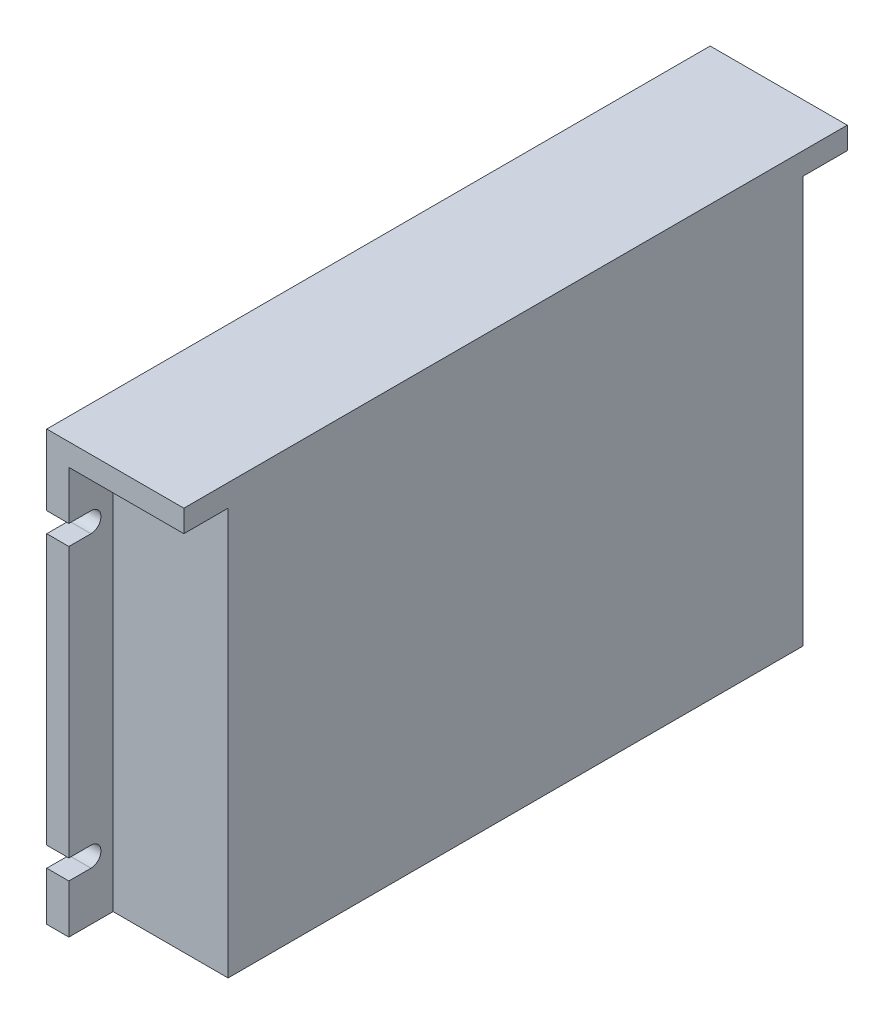
ISO-10303-21;
HEADER;
FILE_DESCRIPTION(('STEP AP214'),'2;1');
FILE_NAME('part.step','',(''),(''),'','','');
FILE_SCHEMA(('AUTOMOTIVE_DESIGN { 1 0 10303 214 1 1 1 1 }'));
ENDSEC;
DATA;
#1=APPLICATION_CONTEXT('core data for automotive mechanical design processes');
#2=APPLICATION_PROTOCOL_DEFINITION('international standard','automotive_design',2000,#1);
#3=PRODUCT_CONTEXT('',#1,'mechanical');
#4=PRODUCT('Part','Part','',(#3));
#5=PRODUCT_RELATED_PRODUCT_CATEGORY('part','',(#4));
#6=PRODUCT_DEFINITION_FORMATION('','',#4);
#7=PRODUCT_DEFINITION_CONTEXT('part definition',#1,'design');
#8=PRODUCT_DEFINITION('design','',#6,#7);
#9=PRODUCT_DEFINITION_SHAPE('','',#8);
#10=(LENGTH_UNIT() NAMED_UNIT(*) SI_UNIT(.MILLI.,.METRE.));
#11=(NAMED_UNIT(*) PLANE_ANGLE_UNIT() SI_UNIT($,.RADIAN.));
#12=(NAMED_UNIT(*) SI_UNIT($,.STERADIAN.) SOLID_ANGLE_UNIT());
#13=UNCERTAINTY_MEASURE_WITH_UNIT(LENGTH_MEASURE(1.E-05),#10,'distance_accuracy_value','');
#14=(GEOMETRIC_REPRESENTATION_CONTEXT(3) GLOBAL_UNCERTAINTY_ASSIGNED_CONTEXT((#13)) GLOBAL_UNIT_ASSIGNED_CONTEXT((#10,
#11,#12)) REPRESENTATION_CONTEXT('',''));
#15=CARTESIAN_POINT('',(0.,0.,0.));
#16=DIRECTION('',(0.,0.,1.));
#17=DIRECTION('',(1.,0.,0.));
#18=AXIS2_PLACEMENT_3D('',#15,#16,#17);
#19=CARTESIAN_POINT('',(31.,48.5,75.));
#20=DIRECTION('',(0.,0.,-1.));
#21=DIRECTION('',(0.,1.,0.));
#22=AXIS2_PLACEMENT_3D('',#19,#20,#21);
#23=PLANE('',#22);
#24=DIRECTION('',(0.,-1.,0.));
#25=VECTOR('',#24,1.);
#26=CARTESIAN_POINT('',(5.,-48.5,75.));
#27=LINE('',#26,#25);
#28=CARTESIAN_POINT('',(5.,28.,75.));
#29=VERTEX_POINT('',#28);
#30=CARTESIAN_POINT('',(5.,-33.,75.));
#31=VERTEX_POINT('',#30);
#32=EDGE_CURVE('E175',#29,#31,#27,.T.);
#33=ORIENTED_EDGE('',*,*,#32,.F.);
#34=DIRECTION('',(1.,0.,0.));
#35=VECTOR('',#34,1.);
#36=CARTESIAN_POINT('',(-21.,28.,75.));
#37=LINE('',#36,#35);
#38=CARTESIAN_POINT('',(0.,28.,75.));
#39=VERTEX_POINT('',#38);
#40=EDGE_CURVE('E398',#39,#29,#37,.T.);
#41=ORIENTED_EDGE('',*,*,#40,.F.);
#42=DIRECTION('',(0.,-1.,0.));
#43=VECTOR('',#42,1.);
#44=CARTESIAN_POINT('',(0.,48.5,75.));
#45=LINE('',#44,#43);
#46=CARTESIAN_POINT('',(0.,-33.,75.));
#47=VERTEX_POINT('',#46);
#48=EDGE_CURVE('E177',#39,#47,#45,.T.);
#49=ORIENTED_EDGE('',*,*,#48,.T.);
#50=DIRECTION('',(1.,0.,0.));
#51=VECTOR('',#50,1.);
#52=CARTESIAN_POINT('',(-21.,-33.,75.));
#53=LINE('',#52,#51);
#54=EDGE_CURVE('E164',#47,#31,#53,.T.);
#55=ORIENTED_EDGE('',*,*,#54,.T.);
#56=EDGE_LOOP('',(#33,#41,#49,#55));
#57=FACE_BOUND('',#56,.T.);
#58=ADVANCED_FACE('F35',(#57),#23,.F.);
#59=CARTESIAN_POINT('',(5.,-37.5,75.));
#60=VERTEX_POINT('',#59);
#61=CARTESIAN_POINT('',(5.,-48.5,75.));
#62=VERTEX_POINT('',#61);
#63=EDGE_CURVE('E185',#60,#62,#27,.T.);
#64=ORIENTED_EDGE('',*,*,#63,.F.);
#65=DIRECTION('',(1.,0.,0.));
#66=VECTOR('',#65,1.);
#67=CARTESIAN_POINT('',(-21.,-37.5,75.));
#68=LINE('',#67,#66);
#69=CARTESIAN_POINT('',(0.,-37.5,75.));
#70=VERTEX_POINT('',#69);
#71=EDGE_CURVE('E178',#70,#60,#68,.T.);
#72=ORIENTED_EDGE('',*,*,#71,.F.);
#73=CARTESIAN_POINT('',(0.,-48.5,75.));
#74=VERTEX_POINT('',#73);
#75=EDGE_CURVE('E211',#70,#74,#45,.T.);
#76=ORIENTED_EDGE('',*,*,#75,.T.);
#77=DIRECTION('',(-1.,0.,0.));
#78=VECTOR('',#77,1.);
#79=CARTESIAN_POINT('',(31.,-48.5,75.));
#80=LINE('',#79,#78);
#81=EDGE_CURVE('E11',#62,#74,#80,.T.);
#82=ORIENTED_EDGE('',*,*,#81,.F.);
#83=EDGE_LOOP('',(#64,#72,#76,#82));
#84=FACE_BOUND('',#83,.T.);
#85=ADVANCED_FACE('F308',(#84),#23,.F.);
#86=CARTESIAN_POINT('',(0.,48.5,75.));
#87=VERTEX_POINT('',#86);
#88=CARTESIAN_POINT('',(0.,32.5,75.));
#89=VERTEX_POINT('',#88);
#90=EDGE_CURVE('E249',#87,#89,#45,.T.);
#91=ORIENTED_EDGE('',*,*,#90,.T.);
#92=DIRECTION('',(1.,0.,0.));
#93=VECTOR('',#92,1.);
#94=CARTESIAN_POINT('',(-21.,32.5,75.));
#95=LINE('',#94,#93);
#96=CARTESIAN_POINT('',(5.,32.5,75.));
#97=VERTEX_POINT('',#96);
#98=EDGE_CURVE('E401',#89,#97,#95,.T.);
#99=ORIENTED_EDGE('',*,*,#98,.T.);
#100=CARTESIAN_POINT('',(5.,43.5,75.));
#101=VERTEX_POINT('',#100);
#102=EDGE_CURVE('E184',#101,#97,#27,.T.);
#103=ORIENTED_EDGE('',*,*,#102,.F.);
#104=DIRECTION('',(1.,0.,0.));
#105=VECTOR('',#104,1.);
#106=CARTESIAN_POINT('',(5.,43.5,75.));
#107=LINE('',#106,#105);
#108=CARTESIAN_POINT('',(31.,43.5,75.));
#109=VERTEX_POINT('',#108);
#110=EDGE_CURVE('E208',#101,#109,#107,.T.);
#111=ORIENTED_EDGE('',*,*,#110,.T.);
#112=DIRECTION('',(0.,-1.,0.));
#113=VECTOR('',#112,1.);
#114=CARTESIAN_POINT('',(31.,48.5,75.));
#115=LINE('',#114,#113);
#116=CARTESIAN_POINT('',(31.,48.5,75.));
#117=VERTEX_POINT('',#116);
#118=EDGE_CURVE('E237',#117,#109,#115,.T.);
#119=ORIENTED_EDGE('',*,*,#118,.F.);
#120=DIRECTION('',(-1.,0.,0.));
#121=VECTOR('',#120,1.);
#122=CARTESIAN_POINT('',(31.,48.5,75.));
#123=LINE('',#122,#121);
#124=EDGE_CURVE('E248',#117,#87,#123,.T.);
#125=ORIENTED_EDGE('',*,*,#124,.T.);
#126=EDGE_LOOP('',(#91,#99,#103,#111,#119,#125));
#127=FACE_BOUND('',#126,.T.);
#128=ADVANCED_FACE('F37',(#127),#23,.F.);
#129=CARTESIAN_POINT('',(31.,-48.5,75.));
#130=DIRECTION('',(0.,1.,0.));
#131=DIRECTION('',(0.,0.,1.));
#132=AXIS2_PLACEMENT_3D('',#129,#130,#131);
#133=PLANE('',#132);
#134=DIRECTION('',(0.,0.,-1.));
#135=VECTOR('',#134,1.);
#136=CARTESIAN_POINT('',(31.,-48.5,75.));
#137=LINE('',#136,#135);
#138=CARTESIAN_POINT('',(31.,-48.5,65.));
#139=VERTEX_POINT('',#138);
#140=CARTESIAN_POINT('',(31.,-48.5,-65.));
#141=VERTEX_POINT('',#140);
#142=EDGE_CURVE('E240',#139,#141,#137,.T.);
#143=ORIENTED_EDGE('',*,*,#142,.F.);
#144=DIRECTION('',(1.,0.,0.));
#145=VECTOR('',#144,1.);
#146=CARTESIAN_POINT('',(5.,-48.5,65.));
#147=LINE('',#146,#145);
#148=CARTESIAN_POINT('',(5.,-48.5,65.));
#149=VERTEX_POINT('',#148);
#150=EDGE_CURVE('E202',#149,#139,#147,.T.);
#151=ORIENTED_EDGE('',*,*,#150,.F.);
#152=DIRECTION('',(0.,0.,-1.));
#153=VECTOR('',#152,1.);
#154=CARTESIAN_POINT('',(5.,-48.5,75.));
#155=LINE('',#154,#153);
#156=EDGE_CURVE('E188',#62,#149,#155,.T.);
#157=ORIENTED_EDGE('',*,*,#156,.F.);
#158=ORIENTED_EDGE('',*,*,#81,.T.);
#159=DIRECTION('',(0.,0.,-1.));
#160=VECTOR('',#159,1.);
#161=CARTESIAN_POINT('',(0.,-48.5,75.));
#162=LINE('',#161,#160);
#163=CARTESIAN_POINT('',(0.,-48.5,-75.));
#164=VERTEX_POINT('',#163);
#165=EDGE_CURVE('E252',#74,#164,#162,.T.);
#166=ORIENTED_EDGE('',*,*,#165,.T.);
#167=DIRECTION('',(-1.,0.,0.));
#168=VECTOR('',#167,1.);
#169=CARTESIAN_POINT('',(31.,-48.5,-75.));
#170=LINE('',#169,#168);
#171=CARTESIAN_POINT('',(5.,-48.5,-75.));
#172=VERTEX_POINT('',#171);
#173=EDGE_CURVE('E43',#172,#164,#170,.T.);
#174=ORIENTED_EDGE('',*,*,#173,.F.);
#175=DIRECTION('',(0.,0.,-1.));
#176=VECTOR('',#175,1.);
#177=CARTESIAN_POINT('',(5.,-48.5,-75.));
#178=LINE('',#177,#176);
#179=CARTESIAN_POINT('',(5.,-48.5,-65.));
#180=VERTEX_POINT('',#179);
#181=EDGE_CURVE('E215',#180,#172,#178,.T.);
#182=ORIENTED_EDGE('',*,*,#181,.F.);
#183=DIRECTION('',(1.,0.,0.));
#184=VECTOR('',#183,1.);
#185=CARTESIAN_POINT('',(5.,-48.5,-65.));
#186=LINE('',#185,#184);
#187=EDGE_CURVE('E206',#180,#141,#186,.T.);
#188=ORIENTED_EDGE('',*,*,#187,.T.);
#189=EDGE_LOOP('',(#143,#151,#157,#158,#166,#174,#182,#188));
#190=FACE_BOUND('',#189,.T.);
#191=ADVANCED_FACE('F274',(#190),#133,.F.);
#192=CARTESIAN_POINT('',(31.,48.5,-75.));
#193=DIRECTION('',(0.,0.,1.));
#194=DIRECTION('',(0.,-1.,0.));
#195=AXIS2_PLACEMENT_3D('',#192,#193,#194);
#196=PLANE('',#195);
#197=DIRECTION('',(0.,1.,0.));
#198=VECTOR('',#197,1.);
#199=CARTESIAN_POINT('',(31.,48.5,-75.));
#200=LINE('',#199,#198);
#201=CARTESIAN_POINT('',(31.,43.5,-75.));
#202=VERTEX_POINT('',#201);
#203=CARTESIAN_POINT('',(31.,48.5,-75.));
#204=VERTEX_POINT('',#203);
#205=EDGE_CURVE('E244',#202,#204,#200,.T.);
#206=ORIENTED_EDGE('',*,*,#205,.F.);
#207=DIRECTION('',(1.,0.,0.));
#208=VECTOR('',#207,1.);
#209=CARTESIAN_POINT('',(5.,43.5,-75.));
#210=LINE('',#209,#208);
#211=CARTESIAN_POINT('',(5.,43.5,-75.));
#212=VERTEX_POINT('',#211);
#213=EDGE_CURVE('E227',#212,#202,#210,.T.);
#214=ORIENTED_EDGE('',*,*,#213,.F.);
#215=DIRECTION('',(0.,1.,0.));
#216=VECTOR('',#215,1.);
#217=CARTESIAN_POINT('',(5.,-48.5,-75.));
#218=LINE('',#217,#216);
#219=EDGE_CURVE('E217',#172,#212,#218,.T.);
#220=ORIENTED_EDGE('',*,*,#219,.F.);
#221=ORIENTED_EDGE('',*,*,#173,.T.);
#222=DIRECTION('',(0.,1.,0.));
#223=VECTOR('',#222,1.);
#224=CARTESIAN_POINT('',(0.,48.5,-75.));
#225=LINE('',#224,#223);
#226=CARTESIAN_POINT('',(0.,48.5,-75.));
#227=VERTEX_POINT('',#226);
#228=EDGE_CURVE('E255',#164,#227,#225,.T.);
#229=ORIENTED_EDGE('',*,*,#228,.T.);
#230=DIRECTION('',(-1.,0.,0.));
#231=VECTOR('',#230,1.);
#232=CARTESIAN_POINT('',(31.,48.5,-75.));
#233=LINE('',#232,#231);
#234=EDGE_CURVE('E260',#204,#227,#233,.T.);
#235=ORIENTED_EDGE('',*,*,#234,.F.);
#236=EDGE_LOOP('',(#206,#214,#220,#221,#229,#235));
#237=FACE_BOUND('',#236,.T.);
#238=ADVANCED_FACE('F266',(#237),#196,.F.);
#239=CARTESIAN_POINT('',(31.,48.5,75.));
#240=DIRECTION('',(0.,-1.,0.));
#241=DIRECTION('',(0.,0.,-1.));
#242=AXIS2_PLACEMENT_3D('',#239,#240,#241);
#243=PLANE('',#242);
#244=DIRECTION('',(0.,0.,1.));
#245=VECTOR('',#244,1.);
#246=CARTESIAN_POINT('',(0.,48.5,75.));
#247=LINE('',#246,#245);
#248=EDGE_CURVE('E241',#227,#87,#247,.T.);
#249=ORIENTED_EDGE('',*,*,#248,.T.);
#250=ORIENTED_EDGE('',*,*,#124,.F.);
#251=DIRECTION('',(0.,0.,1.));
#252=VECTOR('',#251,1.);
#253=CARTESIAN_POINT('',(31.,48.5,75.));
#254=LINE('',#253,#252);
#255=EDGE_CURVE('E246',#204,#117,#254,.T.);
#256=ORIENTED_EDGE('',*,*,#255,.F.);
#257=ORIENTED_EDGE('',*,*,#234,.T.);
#258=EDGE_LOOP('',(#249,#250,#256,#257));
#259=FACE_BOUND('',#258,.T.);
#260=ADVANCED_FACE('F285',(#259),#243,.F.);
#261=CARTESIAN_POINT('',(31.,0.,0.));
#262=DIRECTION('',(1.,0.,0.));
#263=DIRECTION('',(0.,0.,-1.));
#264=AXIS2_PLACEMENT_3D('',#261,#262,#263);
#265=PLANE('',#264);
#266=DIRECTION('',(0.,0.,1.));
#267=VECTOR('',#266,1.);
#268=CARTESIAN_POINT('',(31.,43.5,75.));
#269=LINE('',#268,#267);
#270=CARTESIAN_POINT('',(31.,43.5,65.));
#271=VERTEX_POINT('',#270);
#272=EDGE_CURVE('E189',#271,#109,#269,.T.);
#273=ORIENTED_EDGE('',*,*,#272,.F.);
#274=DIRECTION('',(0.,1.,0.));
#275=VECTOR('',#274,1.);
#276=CARTESIAN_POINT('',(31.,-48.5,65.));
#277=LINE('',#276,#275);
#278=EDGE_CURVE('E203',#139,#271,#277,.T.);
#279=ORIENTED_EDGE('',*,*,#278,.F.);
#280=ORIENTED_EDGE('',*,*,#142,.T.);
#281=DIRECTION('',(0.,-1.,0.));
#282=VECTOR('',#281,1.);
#283=CARTESIAN_POINT('',(31.,-48.5,-65.));
#284=LINE('',#283,#282);
#285=CARTESIAN_POINT('',(31.,43.5,-65.));
#286=VERTEX_POINT('',#285);
#287=EDGE_CURVE('E218',#286,#141,#284,.T.);
#288=ORIENTED_EDGE('',*,*,#287,.F.);
#289=DIRECTION('',(0.,0.,1.));
#290=VECTOR('',#289,1.);
#291=CARTESIAN_POINT('',(31.,43.5,-75.));
#292=LINE('',#291,#290);
#293=EDGE_CURVE('E228',#202,#286,#292,.T.);
#294=ORIENTED_EDGE('',*,*,#293,.F.);
#295=ORIENTED_EDGE('',*,*,#205,.T.);
#296=ORIENTED_EDGE('',*,*,#255,.T.);
#297=ORIENTED_EDGE('',*,*,#118,.T.);
#298=EDGE_LOOP('',(#273,#279,#280,#288,#294,#295,#296,#297));
#299=FACE_BOUND('',#298,.T.);
#300=ADVANCED_FACE('F293',(#299),#265,.T.);
#301=CARTESIAN_POINT('',(0.,0.,0.));
#302=DIRECTION('',(1.,0.,0.));
#303=DIRECTION('',(0.,0.,-1.));
#304=AXIS2_PLACEMENT_3D('',#301,#302,#303);
#305=PLANE('',#304);
#306=CARTESIAN_POINT('',(0.,-35.25,-70.));
#307=DIRECTION('',(1.,0.,0.));
#308=DIRECTION('',(0.,0.,-1.));
#309=AXIS2_PLACEMENT_3D('',#306,#307,#308);
#310=CIRCLE('',#309,2.25);
#311=CARTESIAN_POINT('',(0.,-35.25,-72.25));
#312=VERTEX_POINT('',#311);
#313=EDGE_CURVE('E192',#312,#312,#310,.T.);
#314=ORIENTED_EDGE('',*,*,#313,.T.);
#315=EDGE_LOOP('',(#314));
#316=FACE_BOUND('',#315,.T.);
#317=CARTESIAN_POINT('',(0.,30.25,-70.));
#318=DIRECTION('',(1.,0.,0.));
#319=DIRECTION('',(0.,0.,-1.));
#320=AXIS2_PLACEMENT_3D('',#317,#318,#319);
#321=CIRCLE('',#320,2.25);
#322=CARTESIAN_POINT('',(0.,30.25,-72.25));
#323=VERTEX_POINT('',#322);
#324=EDGE_CURVE('E330',#323,#323,#321,.T.);
#325=ORIENTED_EDGE('',*,*,#324,.T.);
#326=EDGE_LOOP('',(#325));
#327=FACE_BOUND('',#326,.T.);
#328=ORIENTED_EDGE('',*,*,#48,.F.);
#329=DIRECTION('',(0.,0.,-1.));
#330=VECTOR('',#329,1.);
#331=CARTESIAN_POINT('',(0.,28.,0.));
#332=LINE('',#331,#330);
#333=CARTESIAN_POINT('',(0.,28.,70.));
#334=VERTEX_POINT('',#333);
#335=EDGE_CURVE('E325',#39,#334,#332,.T.);
#336=ORIENTED_EDGE('',*,*,#335,.T.);
#337=CARTESIAN_POINT('',(0.,30.25,70.));
#338=DIRECTION('',(1.,0.,0.));
#339=DIRECTION('',(0.,0.,-1.));
#340=AXIS2_PLACEMENT_3D('',#337,#338,#339);
#341=CIRCLE('',#340,2.25);
#342=CARTESIAN_POINT('',(0.,32.5,70.));
#343=VERTEX_POINT('',#342);
#344=EDGE_CURVE('E328',#334,#343,#341,.T.);
#345=ORIENTED_EDGE('',*,*,#344,.T.);
#346=DIRECTION('',(0.,0.,1.));
#347=VECTOR('',#346,1.);
#348=CARTESIAN_POINT('',(0.,32.5,0.));
#349=LINE('',#348,#347);
#350=EDGE_CURVE('E318',#343,#89,#349,.T.);
#351=ORIENTED_EDGE('',*,*,#350,.T.);
#352=ORIENTED_EDGE('',*,*,#90,.F.);
#353=ORIENTED_EDGE('',*,*,#248,.F.);
#354=ORIENTED_EDGE('',*,*,#228,.F.);
#355=ORIENTED_EDGE('',*,*,#165,.F.);
#356=ORIENTED_EDGE('',*,*,#75,.F.);
#357=DIRECTION('',(0.,0.,-1.));
#358=VECTOR('',#357,1.);
#359=CARTESIAN_POINT('',(0.,-37.5,0.));
#360=LINE('',#359,#358);
#361=CARTESIAN_POINT('',(0.,-37.5,70.));
#362=VERTEX_POINT('',#361);
#363=EDGE_CURVE('E312',#70,#362,#360,.T.);
#364=ORIENTED_EDGE('',*,*,#363,.T.);
#365=CARTESIAN_POINT('',(0.,-35.25,70.));
#366=DIRECTION('',(1.,0.,0.));
#367=DIRECTION('',(0.,0.,-1.));
#368=AXIS2_PLACEMENT_3D('',#365,#366,#367);
#369=CIRCLE('',#368,2.24999999999999);
#370=CARTESIAN_POINT('',(0.,-33.,70.));
#371=VERTEX_POINT('',#370);
#372=EDGE_CURVE('E313',#362,#371,#369,.T.);
#373=ORIENTED_EDGE('',*,*,#372,.T.);
#374=DIRECTION('',(0.,0.,1.));
#375=VECTOR('',#374,1.);
#376=CARTESIAN_POINT('',(0.,-33.,0.));
#377=LINE('',#376,#375);
#378=EDGE_CURVE('E316',#371,#47,#377,.T.);
#379=ORIENTED_EDGE('',*,*,#378,.T.);
#380=EDGE_LOOP('',(#328,#336,#345,#351,#352,#353,#354,#355,#356,#364,#373,#379));
#381=FACE_BOUND('',#380,.T.);
#382=ADVANCED_FACE('F280',(#316,#327,#381),#305,.F.);
#383=CARTESIAN_POINT('',(5.,-48.5,-65.));
#384=DIRECTION('',(0.,0.,1.));
#385=DIRECTION('',(1.,0.,0.));
#386=AXIS2_PLACEMENT_3D('',#383,#384,#385);
#387=PLANE('',#386);
#388=ORIENTED_EDGE('',*,*,#287,.T.);
#389=ORIENTED_EDGE('',*,*,#187,.F.);
#390=DIRECTION('',(0.,-1.,0.));
#391=VECTOR('',#390,1.);
#392=CARTESIAN_POINT('',(5.,-48.5,-65.));
#393=LINE('',#392,#391);
#394=CARTESIAN_POINT('',(5.,43.5,-65.));
#395=VERTEX_POINT('',#394);
#396=EDGE_CURVE('E224',#395,#180,#393,.T.);
#397=ORIENTED_EDGE('',*,*,#396,.F.);
#398=DIRECTION('',(1.,0.,0.));
#399=VECTOR('',#398,1.);
#400=CARTESIAN_POINT('',(5.,43.5,-65.));
#401=LINE('',#400,#399);
#402=EDGE_CURVE('E234',#395,#286,#401,.T.);
#403=ORIENTED_EDGE('',*,*,#402,.T.);
#404=EDGE_LOOP('',(#388,#389,#397,#403));
#405=FACE_BOUND('',#404,.T.);
#406=ADVANCED_FACE('F369',(#405),#387,.F.);
#407=CARTESIAN_POINT('',(5.,43.5,-75.));
#408=DIRECTION('',(0.,1.,0.));
#409=DIRECTION('',(0.,0.,1.));
#410=AXIS2_PLACEMENT_3D('',#407,#408,#409);
#411=PLANE('',#410);
#412=ORIENTED_EDGE('',*,*,#293,.T.);
#413=ORIENTED_EDGE('',*,*,#402,.F.);
#414=DIRECTION('',(0.,0.,1.));
#415=VECTOR('',#414,1.);
#416=CARTESIAN_POINT('',(5.,43.5,-75.));
#417=LINE('',#416,#415);
#418=EDGE_CURVE('E221',#212,#395,#417,.T.);
#419=ORIENTED_EDGE('',*,*,#418,.F.);
#420=ORIENTED_EDGE('',*,*,#213,.T.);
#421=EDGE_LOOP('',(#412,#413,#419,#420));
#422=FACE_BOUND('',#421,.T.);
#423=ADVANCED_FACE('F298',(#422),#411,.F.);
#424=CARTESIAN_POINT('',(5.,0.,0.));
#425=DIRECTION('',(-1.,0.,0.));
#426=DIRECTION('',(0.,0.,1.));
#427=AXIS2_PLACEMENT_3D('',#424,#425,#426);
#428=PLANE('',#427);
#429=CARTESIAN_POINT('',(5.,-35.25,-70.));
#430=DIRECTION('',(1.,0.,0.));
#431=DIRECTION('',(0.,0.,-1.));
#432=AXIS2_PLACEMENT_3D('',#429,#430,#431);
#433=CIRCLE('',#432,2.25);
#434=CARTESIAN_POINT('',(5.,-35.25,-72.25));
#435=VERTEX_POINT('',#434);
#436=EDGE_CURVE('E403',#435,#435,#433,.T.);
#437=ORIENTED_EDGE('',*,*,#436,.F.);
#438=EDGE_LOOP('',(#437));
#439=FACE_BOUND('',#438,.T.);
#440=CARTESIAN_POINT('',(5.,30.25,-70.));
#441=DIRECTION('',(1.,0.,0.));
#442=DIRECTION('',(0.,0.,-1.));
#443=AXIS2_PLACEMENT_3D('',#440,#441,#442);
#444=CIRCLE('',#443,2.25);
#445=CARTESIAN_POINT('',(5.,30.25,-72.25));
#446=VERTEX_POINT('',#445);
#447=EDGE_CURVE('E320',#446,#446,#444,.T.);
#448=ORIENTED_EDGE('',*,*,#447,.F.);
#449=EDGE_LOOP('',(#448));
#450=FACE_BOUND('',#449,.T.);
#451=ORIENTED_EDGE('',*,*,#181,.T.);
#452=ORIENTED_EDGE('',*,*,#219,.T.);
#453=ORIENTED_EDGE('',*,*,#418,.T.);
#454=ORIENTED_EDGE('',*,*,#396,.T.);
#455=EDGE_LOOP('',(#451,#452,#453,#454));
#456=FACE_BOUND('',#455,.T.);
#457=ADVANCED_FACE('F301',(#439,#450,#456),#428,.F.);
#458=CARTESIAN_POINT('',(5.,43.5,75.));
#459=DIRECTION('',(0.,1.,0.));
#460=DIRECTION('',(0.,0.,1.));
#461=AXIS2_PLACEMENT_3D('',#458,#459,#460);
#462=PLANE('',#461);
#463=ORIENTED_EDGE('',*,*,#272,.T.);
#464=ORIENTED_EDGE('',*,*,#110,.F.);
#465=DIRECTION('',(0.,0.,1.));
#466=VECTOR('',#465,1.);
#467=CARTESIAN_POINT('',(5.,43.5,75.));
#468=LINE('',#467,#466);
#469=CARTESIAN_POINT('',(5.,43.5,65.));
#470=VERTEX_POINT('',#469);
#471=EDGE_CURVE('E199',#470,#101,#468,.T.);
#472=ORIENTED_EDGE('',*,*,#471,.F.);
#473=DIRECTION('',(1.,0.,0.));
#474=VECTOR('',#473,1.);
#475=CARTESIAN_POINT('',(5.,43.5,65.));
#476=LINE('',#475,#474);
#477=EDGE_CURVE('E212',#470,#271,#476,.T.);
#478=ORIENTED_EDGE('',*,*,#477,.T.);
#479=EDGE_LOOP('',(#463,#464,#472,#478));
#480=FACE_BOUND('',#479,.T.);
#481=ADVANCED_FACE('F378',(#480),#462,.F.);
#482=CARTESIAN_POINT('',(5.,-48.5,65.));
#483=DIRECTION('',(0.,0.,-1.));
#484=DIRECTION('',(-1.,0.,0.));
#485=AXIS2_PLACEMENT_3D('',#482,#483,#484);
#486=PLANE('',#485);
#487=ORIENTED_EDGE('',*,*,#278,.T.);
#488=ORIENTED_EDGE('',*,*,#477,.F.);
#489=DIRECTION('',(0.,1.,0.));
#490=VECTOR('',#489,1.);
#491=CARTESIAN_POINT('',(5.,-48.5,65.));
#492=LINE('',#491,#490);
#493=EDGE_CURVE('E196',#149,#470,#492,.T.);
#494=ORIENTED_EDGE('',*,*,#493,.F.);
#495=ORIENTED_EDGE('',*,*,#150,.T.);
#496=EDGE_LOOP('',(#487,#488,#494,#495));
#497=FACE_BOUND('',#496,.T.);
#498=ADVANCED_FACE('F305',(#497),#486,.F.);
#499=CARTESIAN_POINT('',(5.,0.,0.));
#500=DIRECTION('',(-1.,0.,0.));
#501=DIRECTION('',(0.,0.,1.));
#502=AXIS2_PLACEMENT_3D('',#499,#500,#501);
#503=PLANE('',#502);
#504=CARTESIAN_POINT('',(5.,30.25,70.));
#505=DIRECTION('',(1.,0.,0.));
#506=DIRECTION('',(0.,0.,-1.));
#507=AXIS2_PLACEMENT_3D('',#504,#505,#506);
#508=CIRCLE('',#507,2.25);
#509=CARTESIAN_POINT('',(5.,28.,70.));
#510=VERTEX_POINT('',#509);
#511=CARTESIAN_POINT('',(5.,32.5,70.));
#512=VERTEX_POINT('',#511);
#513=EDGE_CURVE('E50',#510,#512,#508,.T.);
#514=ORIENTED_EDGE('',*,*,#513,.F.);
#515=DIRECTION('',(0.,0.,-1.));
#516=VECTOR('',#515,1.);
#517=CARTESIAN_POINT('',(5.,28.,70.));
#518=LINE('',#517,#516);
#519=EDGE_CURVE('E183',#29,#510,#518,.T.);
#520=ORIENTED_EDGE('',*,*,#519,.F.);
#521=ORIENTED_EDGE('',*,*,#32,.T.);
#522=DIRECTION('',(0.,0.,1.));
#523=VECTOR('',#522,1.);
#524=CARTESIAN_POINT('',(5.,-33.,70.));
#525=LINE('',#524,#523);
#526=CARTESIAN_POINT('',(5.,-33.,70.));
#527=VERTEX_POINT('',#526);
#528=EDGE_CURVE('E161',#527,#31,#525,.T.);
#529=ORIENTED_EDGE('',*,*,#528,.F.);
#530=CARTESIAN_POINT('',(5.,-35.25,70.));
#531=DIRECTION('',(1.,0.,0.));
#532=DIRECTION('',(0.,0.,-1.));
#533=AXIS2_PLACEMENT_3D('',#530,#531,#532);
#534=CIRCLE('',#533,2.24999999999999);
#535=CARTESIAN_POINT('',(5.,-37.5,70.));
#536=VERTEX_POINT('',#535);
#537=EDGE_CURVE('E58',#536,#527,#534,.T.);
#538=ORIENTED_EDGE('',*,*,#537,.F.);
#539=DIRECTION('',(0.,0.,-1.));
#540=VECTOR('',#539,1.);
#541=CARTESIAN_POINT('',(5.,-37.5,70.));
#542=LINE('',#541,#540);
#543=EDGE_CURVE('E169',#60,#536,#542,.T.);
#544=ORIENTED_EDGE('',*,*,#543,.F.);
#545=ORIENTED_EDGE('',*,*,#63,.T.);
#546=ORIENTED_EDGE('',*,*,#156,.T.);
#547=ORIENTED_EDGE('',*,*,#493,.T.);
#548=ORIENTED_EDGE('',*,*,#471,.T.);
#549=ORIENTED_EDGE('',*,*,#102,.T.);
#550=DIRECTION('',(0.,0.,1.));
#551=VECTOR('',#550,1.);
#552=CARTESIAN_POINT('',(5.,32.5,70.));
#553=LINE('',#552,#551);
#554=EDGE_CURVE('E416',#512,#97,#553,.T.);
#555=ORIENTED_EDGE('',*,*,#554,.F.);
#556=EDGE_LOOP('',(#514,#520,#521,#529,#538,#544,#545,#546,#547,#548,#549,#555));
#557=FACE_BOUND('',#556,.T.);
#558=ADVANCED_FACE('F181',(#557),#503,.F.);
#559=CARTESIAN_POINT('',(-21.,-35.25,70.));
#560=DIRECTION('',(1.,0.,0.));
#561=DIRECTION('',(0.,0.,-1.));
#562=AXIS2_PLACEMENT_3D('',#559,#560,#561);
#563=CYLINDRICAL_SURFACE('',#562,2.24999999999999);
#564=DIRECTION('',(1.,0.,0.));
#565=VECTOR('',#564,1.);
#566=CARTESIAN_POINT('',(-21.,-37.5,70.));
#567=LINE('',#566,#565);
#568=EDGE_CURVE('E417',#362,#536,#567,.T.);
#569=ORIENTED_EDGE('',*,*,#568,.T.);
#570=ORIENTED_EDGE('',*,*,#537,.T.);
#571=DIRECTION('',(1.,0.,0.));
#572=VECTOR('',#571,1.);
#573=CARTESIAN_POINT('',(-21.,-33.,70.));
#574=LINE('',#573,#572);
#575=EDGE_CURVE('E166',#371,#527,#574,.T.);
#576=ORIENTED_EDGE('',*,*,#575,.F.);
#577=ORIENTED_EDGE('',*,*,#372,.F.);
#578=EDGE_LOOP('',(#569,#570,#576,#577));
#579=FACE_BOUND('',#578,.T.);
#580=ADVANCED_FACE('F386',(#579),#563,.F.);
#581=CARTESIAN_POINT('',(-21.,-37.5,70.));
#582=DIRECTION('',(0.,-1.,0.));
#583=DIRECTION('',(0.,0.,-1.));
#584=AXIS2_PLACEMENT_3D('',#581,#582,#583);
#585=PLANE('',#584);
#586=ORIENTED_EDGE('',*,*,#71,.T.);
#587=ORIENTED_EDGE('',*,*,#543,.T.);
#588=ORIENTED_EDGE('',*,*,#568,.F.);
#589=ORIENTED_EDGE('',*,*,#363,.F.);
#590=EDGE_LOOP('',(#586,#587,#588,#589));
#591=FACE_BOUND('',#590,.T.);
#592=ADVANCED_FACE('F426',(#591),#585,.F.);
#593=CARTESIAN_POINT('',(-21.,-33.,70.));
#594=DIRECTION('',(0.,1.,0.));
#595=DIRECTION('',(0.,0.,1.));
#596=AXIS2_PLACEMENT_3D('',#593,#594,#595);
#597=PLANE('',#596);
#598=ORIENTED_EDGE('',*,*,#575,.T.);
#599=ORIENTED_EDGE('',*,*,#528,.T.);
#600=ORIENTED_EDGE('',*,*,#54,.F.);
#601=ORIENTED_EDGE('',*,*,#378,.F.);
#602=EDGE_LOOP('',(#598,#599,#600,#601));
#603=FACE_BOUND('',#602,.T.);
#604=ADVANCED_FACE('F163',(#603),#597,.F.);
#605=CARTESIAN_POINT('',(-21.,30.25,70.));
#606=DIRECTION('',(1.,0.,0.));
#607=DIRECTION('',(0.,0.,-1.));
#608=AXIS2_PLACEMENT_3D('',#605,#606,#607);
#609=CYLINDRICAL_SURFACE('',#608,2.25);
#610=DIRECTION('',(1.,0.,0.));
#611=VECTOR('',#610,1.);
#612=CARTESIAN_POINT('',(-21.,28.,70.));
#613=LINE('',#612,#611);
#614=EDGE_CURVE('E400',#334,#510,#613,.T.);
#615=ORIENTED_EDGE('',*,*,#614,.T.);
#616=ORIENTED_EDGE('',*,*,#513,.T.);
#617=DIRECTION('',(1.,0.,0.));
#618=VECTOR('',#617,1.);
#619=CARTESIAN_POINT('',(-21.,32.5,70.));
#620=LINE('',#619,#618);
#621=EDGE_CURVE('E405',#343,#512,#620,.T.);
#622=ORIENTED_EDGE('',*,*,#621,.F.);
#623=ORIENTED_EDGE('',*,*,#344,.F.);
#624=EDGE_LOOP('',(#615,#616,#622,#623));
#625=FACE_BOUND('',#624,.T.);
#626=ADVANCED_FACE('F388',(#625),#609,.F.);
#627=CARTESIAN_POINT('',(-21.,28.,70.));
#628=DIRECTION('',(0.,-1.,0.));
#629=DIRECTION('',(0.,0.,-1.));
#630=AXIS2_PLACEMENT_3D('',#627,#628,#629);
#631=PLANE('',#630);
#632=ORIENTED_EDGE('',*,*,#40,.T.);
#633=ORIENTED_EDGE('',*,*,#519,.T.);
#634=ORIENTED_EDGE('',*,*,#614,.F.);
#635=ORIENTED_EDGE('',*,*,#335,.F.);
#636=EDGE_LOOP('',(#632,#633,#634,#635));
#637=FACE_BOUND('',#636,.T.);
#638=ADVANCED_FACE('F391',(#637),#631,.F.);
#639=CARTESIAN_POINT('',(-21.,32.5,70.));
#640=DIRECTION('',(0.,1.,0.));
#641=DIRECTION('',(0.,0.,1.));
#642=AXIS2_PLACEMENT_3D('',#639,#640,#641);
#643=PLANE('',#642);
#644=ORIENTED_EDGE('',*,*,#621,.T.);
#645=ORIENTED_EDGE('',*,*,#554,.T.);
#646=ORIENTED_EDGE('',*,*,#98,.F.);
#647=ORIENTED_EDGE('',*,*,#350,.F.);
#648=EDGE_LOOP('',(#644,#645,#646,#647));
#649=FACE_BOUND('',#648,.T.);
#650=ADVANCED_FACE('F346',(#649),#643,.F.);
#651=CARTESIAN_POINT('',(-21.,30.25,-70.));
#652=DIRECTION('',(1.,0.,0.));
#653=DIRECTION('',(0.,0.,-1.));
#654=AXIS2_PLACEMENT_3D('',#651,#652,#653);
#655=CYLINDRICAL_SURFACE('',#654,2.25);
#656=CARTESIAN_POINT('',(5.,30.25,-72.25));
#657=CARTESIAN_POINT('',(4.94791666666667,30.25,-72.25));
#658=CARTESIAN_POINT('',(4.89583333333333,30.25,-72.25));
#659=CARTESIAN_POINT('',(4.79166666666667,30.25,-72.25));
#660=CARTESIAN_POINT('',(4.73958333333333,30.25,-72.25));
#661=CARTESIAN_POINT('',(4.63541666666667,30.25,-72.25));
#662=CARTESIAN_POINT('',(4.58333333333333,30.25,-72.25));
#663=CARTESIAN_POINT('',(4.47916666666667,30.25,-72.25));
#664=CARTESIAN_POINT('',(4.42708333333333,30.25,-72.25));
#665=CARTESIAN_POINT('',(4.32291666666667,30.25,-72.25));
#666=CARTESIAN_POINT('',(4.27083333333333,30.25,-72.25));
#667=CARTESIAN_POINT('',(4.16666666666667,30.25,-72.25));
#668=CARTESIAN_POINT('',(4.11458333333333,30.25,-72.25));
#669=CARTESIAN_POINT('',(4.01041666666667,30.25,-72.25));
#670=CARTESIAN_POINT('',(3.95833333333333,30.25,-72.25));
#671=CARTESIAN_POINT('',(3.85416666666667,30.25,-72.25));
#672=CARTESIAN_POINT('',(3.80208333333333,30.25,-72.25));
#673=CARTESIAN_POINT('',(3.69791666666667,30.25,-72.25));
#674=CARTESIAN_POINT('',(3.64583333333333,30.25,-72.25));
#675=CARTESIAN_POINT('',(3.54166666666667,30.25,-72.25));
#676=CARTESIAN_POINT('',(3.48958333333333,30.25,-72.25));
#677=CARTESIAN_POINT('',(3.38541666666667,30.25,-72.25));
#678=CARTESIAN_POINT('',(3.33333333333333,30.25,-72.25));
#679=CARTESIAN_POINT('',(3.22916666666667,30.25,-72.25));
#680=CARTESIAN_POINT('',(3.17708333333333,30.25,-72.25));
#681=CARTESIAN_POINT('',(3.07291666666667,30.25,-72.25));
#682=CARTESIAN_POINT('',(3.02083333333333,30.25,-72.25));
#683=CARTESIAN_POINT('',(2.91666666666667,30.25,-72.25));
#684=CARTESIAN_POINT('',(2.86458333333333,30.25,-72.25));
#685=CARTESIAN_POINT('',(2.76041666666667,30.25,-72.25));
#686=CARTESIAN_POINT('',(2.70833333333333,30.25,-72.25));
#687=CARTESIAN_POINT('',(2.60416666666667,30.25,-72.25));
#688=CARTESIAN_POINT('',(2.55208333333333,30.25,-72.25));
#689=CARTESIAN_POINT('',(2.44791666666667,30.25,-72.25));
#690=CARTESIAN_POINT('',(2.39583333333333,30.25,-72.25));
#691=CARTESIAN_POINT('',(2.29166666666667,30.25,-72.25));
#692=CARTESIAN_POINT('',(2.23958333333333,30.25,-72.25));
#693=CARTESIAN_POINT('',(2.13541666666667,30.25,-72.25));
#694=CARTESIAN_POINT('',(2.08333333333333,30.25,-72.25));
#695=CARTESIAN_POINT('',(1.97916666666667,30.25,-72.25));
#696=CARTESIAN_POINT('',(1.92708333333333,30.25,-72.25));
#697=CARTESIAN_POINT('',(1.82291666666666,30.25,-72.25));
#698=CARTESIAN_POINT('',(1.77083333333333,30.25,-72.25));
#699=CARTESIAN_POINT('',(1.66666666666666,30.25,-72.25));
#700=CARTESIAN_POINT('',(1.61458333333333,30.25,-72.25));
#701=CARTESIAN_POINT('',(1.51041666666666,30.25,-72.25));
#702=CARTESIAN_POINT('',(1.45833333333333,30.25,-72.25));
#703=CARTESIAN_POINT('',(1.35416666666666,30.25,-72.25));
#704=CARTESIAN_POINT('',(1.30208333333333,30.25,-72.25));
#705=CARTESIAN_POINT('',(1.19791666666666,30.25,-72.25));
#706=CARTESIAN_POINT('',(1.14583333333333,30.25,-72.25));
#707=CARTESIAN_POINT('',(1.04166666666666,30.25,-72.25));
#708=CARTESIAN_POINT('',(0.989583333333331,30.25,-72.25));
#709=CARTESIAN_POINT('',(0.885416666666664,30.25,-72.25));
#710=CARTESIAN_POINT('',(0.833333333333331,30.25,-72.25));
#711=CARTESIAN_POINT('',(0.729166666666664,30.25,-72.25));
#712=CARTESIAN_POINT('',(0.67708333333333,30.25,-72.25));
#713=CARTESIAN_POINT('',(0.572916666666664,30.25,-72.25));
#714=CARTESIAN_POINT('',(0.52083333333333,30.25,-72.25));
#715=CARTESIAN_POINT('',(0.416666666666664,30.25,-72.25));
#716=CARTESIAN_POINT('',(0.36458333333333,30.25,-72.25));
#717=CARTESIAN_POINT('',(0.260416666666663,30.25,-72.25));
#718=CARTESIAN_POINT('',(0.20833333333333,30.25,-72.25));
#719=CARTESIAN_POINT('',(0.104166666666663,30.25,-72.25));
#720=CARTESIAN_POINT('',(0.05208333333333,30.25,-72.25));
#721=CARTESIAN_POINT('',(0.,30.25,-72.25));
#722=B_SPLINE_CURVE_WITH_KNOTS('',3,(#656,#657,#658,#659,#660,#661,#662,#663,#664,#665,#666,
#667,#668,#669,#670,#671,#672,#673,#674,#675,#676,#677,#678,#679,#680,#681,#682,#683,#684,#685,
#686,#687,#688,#689,#690,#691,#692,#693,#694,#695,#696,#697,#698,#699,#700,#701,#702,#703,#704,
#705,#706,#707,#708,#709,#710,#711,#712,#713,#714,#715,#716,#717,#718,#719,#720,#721),
.UNSPECIFIED.,.F.,.F.,(4,2,2,2,2,2,2,2,2,2,2,2,2,2,2,2,2,2,2,2,2,2,2,2,2,2,2,2,2,2,2,2,4),(0.,
0.15625,0.3125,0.46875,0.625000000000001,0.781250000000001,0.937500000000001,1.09375,1.25,
1.40625,1.5625,1.71875,1.875,2.03125,2.1875,2.34375,2.5,2.65625,2.8125,2.96875,3.125,3.28125,
3.4375,3.59375,3.75,3.90625,4.0625,4.21875,4.375,4.53125,4.6875,4.84375,5.),.UNSPECIFIED.);
#723=EDGE_CURVE('BSEAM340',#446,#323,#722,.T.);
#724=ORIENTED_EDGE('',*,*,#447,.T.);
#725=ORIENTED_EDGE('',*,*,#324,.F.);
#726=ORIENTED_EDGE('',*,*,#723,.T.);
#727=ORIENTED_EDGE('',*,*,#723,.F.);
#728=EDGE_LOOP('',(#724,#726,#725,#727));
#729=FACE_BOUND('',#728,.T.);
#730=ADVANCED_FACE('F340',(#729),#655,.F.);
#731=CARTESIAN_POINT('',(-21.,-35.25,-70.));
#732=DIRECTION('',(1.,0.,0.));
#733=DIRECTION('',(0.,0.,-1.));
#734=AXIS2_PLACEMENT_3D('',#731,#732,#733);
#735=CYLINDRICAL_SURFACE('',#734,2.25);
#736=CARTESIAN_POINT('',(5.,-35.25,-72.25));
#737=CARTESIAN_POINT('',(4.94791666666667,-35.25,-72.25));
#738=CARTESIAN_POINT('',(4.89583333333333,-35.25,-72.25));
#739=CARTESIAN_POINT('',(4.79166666666667,-35.25,-72.25));
#740=CARTESIAN_POINT('',(4.73958333333333,-35.25,-72.25));
#741=CARTESIAN_POINT('',(4.63541666666667,-35.25,-72.25));
#742=CARTESIAN_POINT('',(4.58333333333333,-35.25,-72.25));
#743=CARTESIAN_POINT('',(4.47916666666667,-35.25,-72.25));
#744=CARTESIAN_POINT('',(4.42708333333333,-35.25,-72.25));
#745=CARTESIAN_POINT('',(4.32291666666667,-35.25,-72.25));
#746=CARTESIAN_POINT('',(4.27083333333333,-35.25,-72.25));
#747=CARTESIAN_POINT('',(4.16666666666667,-35.25,-72.25));
#748=CARTESIAN_POINT('',(4.11458333333333,-35.25,-72.25));
#749=CARTESIAN_POINT('',(4.01041666666667,-35.25,-72.25));
#750=CARTESIAN_POINT('',(3.95833333333333,-35.25,-72.25));
#751=CARTESIAN_POINT('',(3.85416666666667,-35.25,-72.25));
#752=CARTESIAN_POINT('',(3.80208333333333,-35.25,-72.25));
#753=CARTESIAN_POINT('',(3.69791666666667,-35.25,-72.25));
#754=CARTESIAN_POINT('',(3.64583333333333,-35.25,-72.25));
#755=CARTESIAN_POINT('',(3.54166666666667,-35.25,-72.25));
#756=CARTESIAN_POINT('',(3.48958333333333,-35.25,-72.25));
#757=CARTESIAN_POINT('',(3.38541666666667,-35.25,-72.25));
#758=CARTESIAN_POINT('',(3.33333333333333,-35.25,-72.25));
#759=CARTESIAN_POINT('',(3.22916666666667,-35.25,-72.25));
#760=CARTESIAN_POINT('',(3.17708333333333,-35.25,-72.25));
#761=CARTESIAN_POINT('',(3.07291666666667,-35.25,-72.25));
#762=CARTESIAN_POINT('',(3.02083333333333,-35.25,-72.25));
#763=CARTESIAN_POINT('',(2.91666666666667,-35.25,-72.25));
#764=CARTESIAN_POINT('',(2.86458333333333,-35.25,-72.25));
#765=CARTESIAN_POINT('',(2.76041666666667,-35.25,-72.25));
#766=CARTESIAN_POINT('',(2.70833333333333,-35.25,-72.25));
#767=CARTESIAN_POINT('',(2.60416666666667,-35.25,-72.25));
#768=CARTESIAN_POINT('',(2.55208333333333,-35.25,-72.25));
#769=CARTESIAN_POINT('',(2.44791666666667,-35.25,-72.25));
#770=CARTESIAN_POINT('',(2.39583333333333,-35.25,-72.25));
#771=CARTESIAN_POINT('',(2.29166666666667,-35.25,-72.25));
#772=CARTESIAN_POINT('',(2.23958333333333,-35.25,-72.25));
#773=CARTESIAN_POINT('',(2.13541666666667,-35.25,-72.25));
#774=CARTESIAN_POINT('',(2.08333333333333,-35.25,-72.25));
#775=CARTESIAN_POINT('',(1.97916666666667,-35.25,-72.25));
#776=CARTESIAN_POINT('',(1.92708333333333,-35.25,-72.25));
#777=CARTESIAN_POINT('',(1.82291666666666,-35.25,-72.25));
#778=CARTESIAN_POINT('',(1.77083333333333,-35.25,-72.25));
#779=CARTESIAN_POINT('',(1.66666666666666,-35.25,-72.25));
#780=CARTESIAN_POINT('',(1.61458333333333,-35.25,-72.25));
#781=CARTESIAN_POINT('',(1.51041666666666,-35.25,-72.25));
#782=CARTESIAN_POINT('',(1.45833333333333,-35.25,-72.25));
#783=CARTESIAN_POINT('',(1.35416666666666,-35.25,-72.25));
#784=CARTESIAN_POINT('',(1.30208333333333,-35.25,-72.25));
#785=CARTESIAN_POINT('',(1.19791666666666,-35.25,-72.25));
#786=CARTESIAN_POINT('',(1.14583333333333,-35.25,-72.25));
#787=CARTESIAN_POINT('',(1.04166666666666,-35.25,-72.25));
#788=CARTESIAN_POINT('',(0.989583333333331,-35.25,-72.25));
#789=CARTESIAN_POINT('',(0.885416666666664,-35.25,-72.25));
#790=CARTESIAN_POINT('',(0.833333333333331,-35.25,-72.25));
#791=CARTESIAN_POINT('',(0.729166666666664,-35.25,-72.25));
#792=CARTESIAN_POINT('',(0.67708333333333,-35.25,-72.25));
#793=CARTESIAN_POINT('',(0.572916666666664,-35.25,-72.25));
#794=CARTESIAN_POINT('',(0.52083333333333,-35.25,-72.25));
#795=CARTESIAN_POINT('',(0.416666666666664,-35.25,-72.25));
#796=CARTESIAN_POINT('',(0.36458333333333,-35.25,-72.25));
#797=CARTESIAN_POINT('',(0.260416666666663,-35.25,-72.25));
#798=CARTESIAN_POINT('',(0.20833333333333,-35.25,-72.25));
#799=CARTESIAN_POINT('',(0.104166666666663,-35.25,-72.25));
#800=CARTESIAN_POINT('',(0.05208333333333,-35.25,-72.25));
#801=CARTESIAN_POINT('',(0.,-35.25,-72.25));
#802=B_SPLINE_CURVE_WITH_KNOTS('',3,(#736,#737,#738,#739,#740,#741,#742,#743,#744,#745,#746,
#747,#748,#749,#750,#751,#752,#753,#754,#755,#756,#757,#758,#759,#760,#761,#762,#763,#764,#765,
#766,#767,#768,#769,#770,#771,#772,#773,#774,#775,#776,#777,#778,#779,#780,#781,#782,#783,#784,
#785,#786,#787,#788,#789,#790,#791,#792,#793,#794,#795,#796,#797,#798,#799,#800,#801),
.UNSPECIFIED.,.F.,.F.,(4,2,2,2,2,2,2,2,2,2,2,2,2,2,2,2,2,2,2,2,2,2,2,2,2,2,2,2,2,2,2,2,4),(0.,
0.15625,0.3125,0.46875,0.625000000000001,0.781250000000001,0.937500000000001,1.09375,1.25,
1.40625,1.5625,1.71875,1.875,2.03125,2.1875,2.34375,2.5,2.65625,2.8125,2.96875,3.125,3.28125,
3.4375,3.59375,3.75,3.90625,4.0625,4.21875,4.375,4.53125,4.6875,4.84375,5.),.UNSPECIFIED.);
#803=EDGE_CURVE('BSEAM338',#435,#312,#802,.T.);
#804=ORIENTED_EDGE('',*,*,#436,.T.);
#805=ORIENTED_EDGE('',*,*,#313,.F.);
#806=ORIENTED_EDGE('',*,*,#803,.T.);
#807=ORIENTED_EDGE('',*,*,#803,.F.);
#808=EDGE_LOOP('',(#804,#806,#805,#807));
#809=FACE_BOUND('',#808,.T.);
#810=ADVANCED_FACE('F338',(#809),#735,.F.);
#811=CLOSED_SHELL('',(#58,#85,#128,#191,#238,#260,#300,#382,#406,#423,#457,#481,#498,#558,#580,
#592,#604,#626,#638,#650,#730,#810));
#812=MANIFOLD_SOLID_BREP('B2',#811);
#813=ADVANCED_BREP_SHAPE_REPRESENTATION('',(#18,#812),#14);
#814=SHAPE_DEFINITION_REPRESENTATION(#9,#813);
ENDSEC;
END-ISO-10303-21;
